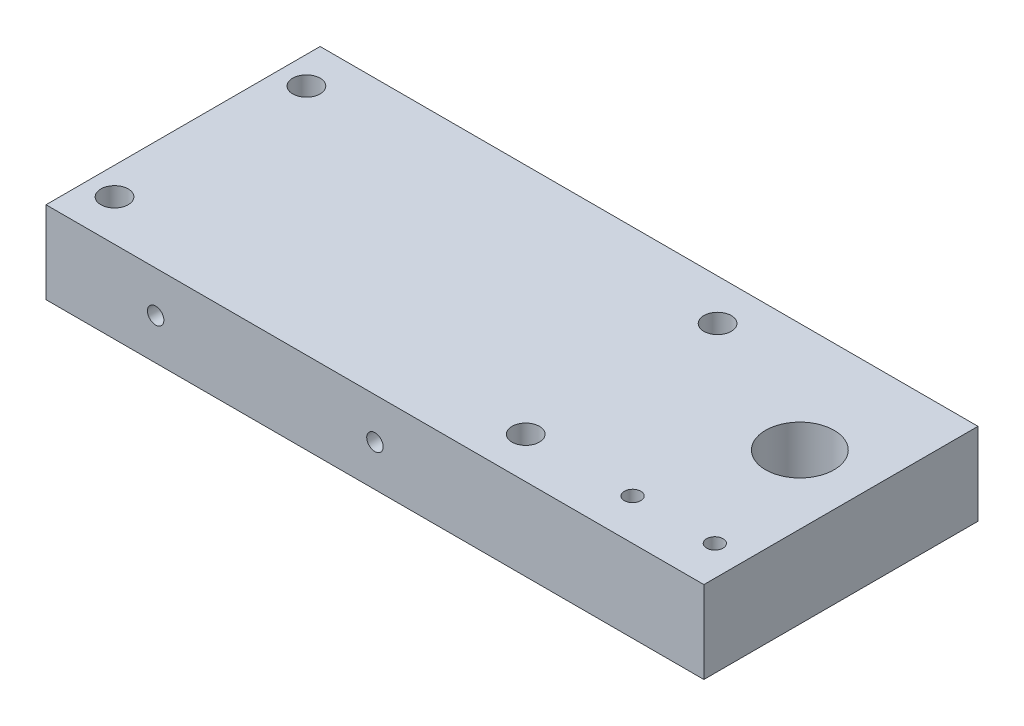
ISO-10303-21;
HEADER;
FILE_DESCRIPTION(('STEP AP214'),'2;1');
FILE_NAME('part.step','',(''),(''),'','','');
FILE_SCHEMA(('AUTOMOTIVE_DESIGN { 1 0 10303 214 1 1 1 1 }'));
ENDSEC;
DATA;
#1=APPLICATION_CONTEXT('core data for automotive mechanical design processes');
#2=APPLICATION_PROTOCOL_DEFINITION('international standard','automotive_design',2000,#1);
#3=PRODUCT_CONTEXT('',#1,'mechanical');
#4=PRODUCT('Part','Part','',(#3));
#5=PRODUCT_RELATED_PRODUCT_CATEGORY('part','',(#4));
#6=PRODUCT_DEFINITION_FORMATION('','',#4);
#7=PRODUCT_DEFINITION_CONTEXT('part definition',#1,'design');
#8=PRODUCT_DEFINITION('design','',#6,#7);
#9=PRODUCT_DEFINITION_SHAPE('','',#8);
#10=(LENGTH_UNIT() NAMED_UNIT(*) SI_UNIT(.MILLI.,.METRE.));
#11=(NAMED_UNIT(*) PLANE_ANGLE_UNIT() SI_UNIT($,.RADIAN.));
#12=(NAMED_UNIT(*) SI_UNIT($,.STERADIAN.) SOLID_ANGLE_UNIT());
#13=UNCERTAINTY_MEASURE_WITH_UNIT(LENGTH_MEASURE(1.E-05),#10,'distance_accuracy_value','');
#14=(GEOMETRIC_REPRESENTATION_CONTEXT(3) GLOBAL_UNCERTAINTY_ASSIGNED_CONTEXT((#13)) GLOBAL_UNIT_ASSIGNED_CONTEXT((#10,
#11,#12)) REPRESENTATION_CONTEXT('',''));
#15=CARTESIAN_POINT('',(0.,0.,0.));
#16=DIRECTION('',(0.,0.,1.));
#17=DIRECTION('',(1.,0.,0.));
#18=AXIS2_PLACEMENT_3D('',#15,#16,#17);
#19=CARTESIAN_POINT('',(120.,30.,50.));
#20=DIRECTION('',(-1.,0.,0.));
#21=DIRECTION('',(0.,0.,1.));
#22=AXIS2_PLACEMENT_3D('',#19,#20,#21);
#23=PLANE('',#22);
#24=DIRECTION('',(0.,0.,-1.));
#25=VECTOR('',#24,1.);
#26=CARTESIAN_POINT('',(120.,0.,50.));
#27=LINE('',#26,#25);
#28=CARTESIAN_POINT('',(120.,0.,50.));
#29=VERTEX_POINT('',#28);
#30=CARTESIAN_POINT('',(120.,0.,-50.));
#31=VERTEX_POINT('',#30);
#32=EDGE_CURVE('E190',#29,#31,#27,.T.);
#33=ORIENTED_EDGE('',*,*,#32,.T.);
#34=DIRECTION('',(0.,-1.,0.));
#35=VECTOR('',#34,1.);
#36=CARTESIAN_POINT('',(120.,30.,-50.));
#37=LINE('',#36,#35);
#38=CARTESIAN_POINT('',(120.,30.,-50.));
#39=VERTEX_POINT('',#38);
#40=EDGE_CURVE('E11',#39,#31,#37,.T.);
#41=ORIENTED_EDGE('',*,*,#40,.F.);
#42=DIRECTION('',(0.,0.,-1.));
#43=VECTOR('',#42,1.);
#44=CARTESIAN_POINT('',(120.,30.,50.));
#45=LINE('',#44,#43);
#46=CARTESIAN_POINT('',(120.,30.,50.));
#47=VERTEX_POINT('',#46);
#48=EDGE_CURVE('E191',#47,#39,#45,.T.);
#49=ORIENTED_EDGE('',*,*,#48,.F.);
#50=DIRECTION('',(0.,-1.,0.));
#51=VECTOR('',#50,1.);
#52=CARTESIAN_POINT('',(120.,30.,50.));
#53=LINE('',#52,#51);
#54=EDGE_CURVE('E197',#47,#29,#53,.T.);
#55=ORIENTED_EDGE('',*,*,#54,.T.);
#56=EDGE_LOOP('',(#33,#41,#49,#55));
#57=FACE_BOUND('',#56,.T.);
#58=ADVANCED_FACE('F17',(#57),#23,.F.);
#59=CARTESIAN_POINT('',(-120.,30.,-50.));
#60=DIRECTION('',(0.,0.,1.));
#61=DIRECTION('',(1.,0.,0.));
#62=AXIS2_PLACEMENT_3D('',#59,#60,#61);
#63=PLANE('',#62);
#64=CARTESIAN_POINT('',(0.,15.,-50.));
#65=DIRECTION('',(0.,0.,-1.));
#66=DIRECTION('',(-1.,0.,0.));
#67=AXIS2_PLACEMENT_3D('',#64,#65,#66);
#68=CIRCLE('',#67,3.);
#69=CARTESIAN_POINT('',(-3.00000000000001,15.,-50.));
#70=VERTEX_POINT('',#69);
#71=EDGE_CURVE('E112',#70,#70,#68,.T.);
#72=ORIENTED_EDGE('',*,*,#71,.F.);
#73=EDGE_LOOP('',(#72));
#74=FACE_BOUND('',#73,.T.);
#75=CARTESIAN_POINT('',(-80.,15.,-50.));
#76=DIRECTION('',(0.,0.,-1.));
#77=DIRECTION('',(-1.,0.,0.));
#78=AXIS2_PLACEMENT_3D('',#75,#76,#77);
#79=CIRCLE('',#78,3.);
#80=CARTESIAN_POINT('',(-83.,15.,-50.));
#81=VERTEX_POINT('',#80);
#82=EDGE_CURVE('E124',#81,#81,#79,.T.);
#83=ORIENTED_EDGE('',*,*,#82,.F.);
#84=EDGE_LOOP('',(#83));
#85=FACE_BOUND('',#84,.T.);
#86=DIRECTION('',(-1.,0.,0.));
#87=VECTOR('',#86,1.);
#88=CARTESIAN_POINT('',(-120.,0.,-50.));
#89=LINE('',#88,#87);
#90=CARTESIAN_POINT('',(-120.,0.,-50.));
#91=VERTEX_POINT('',#90);
#92=EDGE_CURVE('E200',#31,#91,#89,.T.);
#93=ORIENTED_EDGE('',*,*,#92,.T.);
#94=DIRECTION('',(0.,-1.,0.));
#95=VECTOR('',#94,1.);
#96=CARTESIAN_POINT('',(-120.,30.,-50.));
#97=LINE('',#96,#95);
#98=CARTESIAN_POINT('',(-120.,30.,-50.));
#99=VERTEX_POINT('',#98);
#100=EDGE_CURVE('E25',#99,#91,#97,.T.);
#101=ORIENTED_EDGE('',*,*,#100,.F.);
#102=DIRECTION('',(-1.,0.,0.));
#103=VECTOR('',#102,1.);
#104=CARTESIAN_POINT('',(-120.,30.,-50.));
#105=LINE('',#104,#103);
#106=EDGE_CURVE('E64',#39,#99,#105,.T.);
#107=ORIENTED_EDGE('',*,*,#106,.F.);
#108=ORIENTED_EDGE('',*,*,#40,.T.);
#109=EDGE_LOOP('',(#93,#101,#107,#108));
#110=FACE_BOUND('',#109,.T.);
#111=ADVANCED_FACE('F227',(#74,#85,#110),#63,.F.);
#112=CARTESIAN_POINT('',(-120.,30.,50.));
#113=DIRECTION('',(1.,0.,0.));
#114=DIRECTION('',(0.,0.,-1.));
#115=AXIS2_PLACEMENT_3D('',#112,#113,#114);
#116=PLANE('',#115);
#117=DIRECTION('',(0.,0.,1.));
#118=VECTOR('',#117,1.);
#119=CARTESIAN_POINT('',(-120.,0.,50.));
#120=LINE('',#119,#118);
#121=CARTESIAN_POINT('',(-120.,0.,50.));
#122=VERTEX_POINT('',#121);
#123=EDGE_CURVE('E51',#91,#122,#120,.T.);
#124=ORIENTED_EDGE('',*,*,#123,.T.);
#125=DIRECTION('',(0.,-1.,0.));
#126=VECTOR('',#125,1.);
#127=CARTESIAN_POINT('',(-120.,30.,50.));
#128=LINE('',#127,#126);
#129=CARTESIAN_POINT('',(-120.,30.,50.));
#130=VERTEX_POINT('',#129);
#131=EDGE_CURVE('E205',#130,#122,#128,.T.);
#132=ORIENTED_EDGE('',*,*,#131,.F.);
#133=DIRECTION('',(0.,0.,1.));
#134=VECTOR('',#133,1.);
#135=CARTESIAN_POINT('',(-120.,30.,50.));
#136=LINE('',#135,#134);
#137=EDGE_CURVE('E194',#99,#130,#136,.T.);
#138=ORIENTED_EDGE('',*,*,#137,.F.);
#139=ORIENTED_EDGE('',*,*,#100,.T.);
#140=EDGE_LOOP('',(#124,#132,#138,#139));
#141=FACE_BOUND('',#140,.T.);
#142=ADVANCED_FACE('F207',(#141),#116,.F.);
#143=CARTESIAN_POINT('',(-120.,30.,50.));
#144=DIRECTION('',(0.,0.,-1.));
#145=DIRECTION('',(-1.,0.,0.));
#146=AXIS2_PLACEMENT_3D('',#143,#144,#145);
#147=PLANE('',#146);
#148=CARTESIAN_POINT('',(0.,15.,50.));
#149=DIRECTION('',(0.,0.,1.));
#150=DIRECTION('',(1.,0.,0.));
#151=AXIS2_PLACEMENT_3D('',#148,#149,#150);
#152=CIRCLE('',#151,3.);
#153=CARTESIAN_POINT('',(2.99999999999999,15.,50.));
#154=VERTEX_POINT('',#153);
#155=EDGE_CURVE('E561',#154,#154,#152,.T.);
#156=ORIENTED_EDGE('',*,*,#155,.F.);
#157=EDGE_LOOP('',(#156));
#158=FACE_BOUND('',#157,.T.);
#159=CARTESIAN_POINT('',(-80.,15.,50.));
#160=DIRECTION('',(0.,0.,1.));
#161=DIRECTION('',(1.,0.,0.));
#162=AXIS2_PLACEMENT_3D('',#159,#160,#161);
#163=CIRCLE('',#162,3.);
#164=CARTESIAN_POINT('',(-77.,15.,50.));
#165=VERTEX_POINT('',#164);
#166=EDGE_CURVE('E93',#165,#165,#163,.T.);
#167=ORIENTED_EDGE('',*,*,#166,.F.);
#168=EDGE_LOOP('',(#167));
#169=FACE_BOUND('',#168,.T.);
#170=DIRECTION('',(1.,0.,0.));
#171=VECTOR('',#170,1.);
#172=CARTESIAN_POINT('',(-120.,0.,50.));
#173=LINE('',#172,#171);
#174=EDGE_CURVE('E57',#122,#29,#173,.T.);
#175=ORIENTED_EDGE('',*,*,#174,.T.);
#176=ORIENTED_EDGE('',*,*,#54,.F.);
#177=DIRECTION('',(1.,0.,0.));
#178=VECTOR('',#177,1.);
#179=CARTESIAN_POINT('',(-120.,30.,50.));
#180=LINE('',#179,#178);
#181=EDGE_CURVE('E33',#130,#47,#180,.T.);
#182=ORIENTED_EDGE('',*,*,#181,.F.);
#183=ORIENTED_EDGE('',*,*,#131,.T.);
#184=EDGE_LOOP('',(#175,#176,#182,#183));
#185=FACE_BOUND('',#184,.T.);
#186=ADVANCED_FACE('F214',(#158,#169,#185),#147,.F.);
#187=CARTESIAN_POINT('',(0.,30.,0.));
#188=DIRECTION('',(0.,-1.,0.));
#189=DIRECTION('',(0.,0.,-1.));
#190=AXIS2_PLACEMENT_3D('',#187,#188,#189);
#191=PLANE('',#190);
#192=CARTESIAN_POINT('',(79.,30.,35.));
#193=DIRECTION('',(0.,1.,0.));
#194=DIRECTION('',(0.,0.,1.));
#195=AXIS2_PLACEMENT_3D('',#192,#193,#194);
#196=CIRCLE('',#195,3.);
#197=CARTESIAN_POINT('',(79.,30.,38.));
#198=VERTEX_POINT('',#197);
#199=EDGE_CURVE('E136',#198,#198,#196,.T.);
#200=ORIENTED_EDGE('',*,*,#199,.F.);
#201=EDGE_LOOP('',(#200));
#202=FACE_BOUND('',#201,.T.);
#203=CARTESIAN_POINT('',(109.,30.,35.));
#204=DIRECTION('',(0.,1.,0.));
#205=DIRECTION('',(0.,0.,1.));
#206=AXIS2_PLACEMENT_3D('',#203,#204,#205);
#207=CIRCLE('',#206,3.);
#208=CARTESIAN_POINT('',(109.,30.,38.));
#209=VERTEX_POINT('',#208);
#210=EDGE_CURVE('E148',#209,#209,#207,.T.);
#211=ORIENTED_EDGE('',*,*,#210,.F.);
#212=EDGE_LOOP('',(#211));
#213=FACE_BOUND('',#212,.T.);
#214=CARTESIAN_POINT('',(95.,30.,-10.));
#215=DIRECTION('',(0.,1.,0.));
#216=DIRECTION('',(0.,0.,1.));
#217=AXIS2_PLACEMENT_3D('',#214,#215,#216);
#218=CIRCLE('',#217,12.5);
#219=CARTESIAN_POINT('',(95.,30.,2.5));
#220=VERTEX_POINT('',#219);
#221=EDGE_CURVE('E160',#220,#220,#218,.T.);
#222=ORIENTED_EDGE('',*,*,#221,.F.);
#223=EDGE_LOOP('',(#222));
#224=FACE_BOUND('',#223,.T.);
#225=CARTESIAN_POINT('',(40.,30.,35.));
#226=DIRECTION('',(0.,1.,0.));
#227=DIRECTION('',(0.,0.,1.));
#228=AXIS2_PLACEMENT_3D('',#225,#226,#227);
#229=CIRCLE('',#228,5.);
#230=CARTESIAN_POINT('',(40.,30.,40.));
#231=VERTEX_POINT('',#230);
#232=EDGE_CURVE('E166',#231,#231,#229,.T.);
#233=ORIENTED_EDGE('',*,*,#232,.F.);
#234=EDGE_LOOP('',(#233));
#235=FACE_BOUND('',#234,.T.);
#236=CARTESIAN_POINT('',(-110.,30.,35.));
#237=DIRECTION('',(0.,1.,0.));
#238=DIRECTION('',(0.,0.,1.));
#239=AXIS2_PLACEMENT_3D('',#236,#237,#238);
#240=CIRCLE('',#239,5.);
#241=CARTESIAN_POINT('',(-110.,30.,40.));
#242=VERTEX_POINT('',#241);
#243=EDGE_CURVE('E172',#242,#242,#240,.T.);
#244=ORIENTED_EDGE('',*,*,#243,.F.);
#245=EDGE_LOOP('',(#244));
#246=FACE_BOUND('',#245,.T.);
#247=CARTESIAN_POINT('',(-110.,30.,-35.));
#248=DIRECTION('',(0.,1.,0.));
#249=DIRECTION('',(0.,0.,1.));
#250=AXIS2_PLACEMENT_3D('',#247,#248,#249);
#251=CIRCLE('',#250,5.);
#252=CARTESIAN_POINT('',(-110.,30.,-30.));
#253=VERTEX_POINT('',#252);
#254=EDGE_CURVE('E178',#253,#253,#251,.T.);
#255=ORIENTED_EDGE('',*,*,#254,.F.);
#256=EDGE_LOOP('',(#255));
#257=FACE_BOUND('',#256,.T.);
#258=CARTESIAN_POINT('',(40.,30.,-35.));
#259=DIRECTION('',(0.,1.,0.));
#260=DIRECTION('',(0.,0.,1.));
#261=AXIS2_PLACEMENT_3D('',#258,#259,#260);
#262=CIRCLE('',#261,5.);
#263=CARTESIAN_POINT('',(40.,30.,-30.));
#264=VERTEX_POINT('',#263);
#265=EDGE_CURVE('E184',#264,#264,#262,.T.);
#266=ORIENTED_EDGE('',*,*,#265,.F.);
#267=EDGE_LOOP('',(#266));
#268=FACE_BOUND('',#267,.T.);
#269=ORIENTED_EDGE('',*,*,#48,.T.);
#270=ORIENTED_EDGE('',*,*,#106,.T.);
#271=ORIENTED_EDGE('',*,*,#137,.T.);
#272=ORIENTED_EDGE('',*,*,#181,.T.);
#273=EDGE_LOOP('',(#269,#270,#271,#272));
#274=FACE_BOUND('',#273,.T.);
#275=ADVANCED_FACE('F216',(#202,#213,#224,#235,#246,#257,#268,#274),#191,.F.);
#276=CARTESIAN_POINT('',(0.,0.,0.));
#277=DIRECTION('',(0.,-1.,0.));
#278=DIRECTION('',(0.,0.,-1.));
#279=AXIS2_PLACEMENT_3D('',#276,#277,#278);
#280=PLANE('',#279);
#281=CARTESIAN_POINT('',(95.,0.,-10.));
#282=DIRECTION('',(0.,1.,0.));
#283=DIRECTION('',(0.,0.,1.));
#284=AXIS2_PLACEMENT_3D('',#281,#282,#283);
#285=CIRCLE('',#284,12.5);
#286=CARTESIAN_POINT('',(95.,0.,2.5));
#287=VERTEX_POINT('',#286);
#288=EDGE_CURVE('E163',#287,#287,#285,.T.);
#289=ORIENTED_EDGE('',*,*,#288,.T.);
#290=EDGE_LOOP('',(#289));
#291=FACE_BOUND('',#290,.T.);
#292=CARTESIAN_POINT('',(40.,0.,35.));
#293=DIRECTION('',(0.,1.,0.));
#294=DIRECTION('',(0.,0.,1.));
#295=AXIS2_PLACEMENT_3D('',#292,#293,#294);
#296=CIRCLE('',#295,5.);
#297=CARTESIAN_POINT('',(40.,0.,40.));
#298=VERTEX_POINT('',#297);
#299=EDGE_CURVE('E169',#298,#298,#296,.T.);
#300=ORIENTED_EDGE('',*,*,#299,.T.);
#301=EDGE_LOOP('',(#300));
#302=FACE_BOUND('',#301,.T.);
#303=CARTESIAN_POINT('',(-110.,0.,35.));
#304=DIRECTION('',(0.,1.,0.));
#305=DIRECTION('',(0.,0.,1.));
#306=AXIS2_PLACEMENT_3D('',#303,#304,#305);
#307=CIRCLE('',#306,5.);
#308=CARTESIAN_POINT('',(-110.,0.,40.));
#309=VERTEX_POINT('',#308);
#310=EDGE_CURVE('E175',#309,#309,#307,.T.);
#311=ORIENTED_EDGE('',*,*,#310,.T.);
#312=EDGE_LOOP('',(#311));
#313=FACE_BOUND('',#312,.T.);
#314=CARTESIAN_POINT('',(-110.,0.,-35.));
#315=DIRECTION('',(0.,1.,0.));
#316=DIRECTION('',(0.,0.,1.));
#317=AXIS2_PLACEMENT_3D('',#314,#315,#316);
#318=CIRCLE('',#317,5.);
#319=CARTESIAN_POINT('',(-110.,0.,-30.));
#320=VERTEX_POINT('',#319);
#321=EDGE_CURVE('E181',#320,#320,#318,.T.);
#322=ORIENTED_EDGE('',*,*,#321,.T.);
#323=EDGE_LOOP('',(#322));
#324=FACE_BOUND('',#323,.T.);
#325=CARTESIAN_POINT('',(40.,0.,-35.));
#326=DIRECTION('',(0.,1.,0.));
#327=DIRECTION('',(0.,0.,1.));
#328=AXIS2_PLACEMENT_3D('',#325,#326,#327);
#329=CIRCLE('',#328,5.);
#330=CARTESIAN_POINT('',(40.,0.,-30.));
#331=VERTEX_POINT('',#330);
#332=EDGE_CURVE('E187',#331,#331,#329,.T.);
#333=ORIENTED_EDGE('',*,*,#332,.T.);
#334=EDGE_LOOP('',(#333));
#335=FACE_BOUND('',#334,.T.);
#336=ORIENTED_EDGE('',*,*,#32,.F.);
#337=ORIENTED_EDGE('',*,*,#174,.F.);
#338=ORIENTED_EDGE('',*,*,#123,.F.);
#339=ORIENTED_EDGE('',*,*,#92,.F.);
#340=EDGE_LOOP('',(#336,#337,#338,#339));
#341=FACE_BOUND('',#340,.T.);
#342=ADVANCED_FACE('F210',(#291,#302,#313,#324,#335,#341),#280,.T.);
#343=CARTESIAN_POINT('',(40.,30.,-35.));
#344=DIRECTION('',(0.,1.,0.));
#345=DIRECTION('',(0.,0.,1.));
#346=AXIS2_PLACEMENT_3D('',#343,#344,#345);
#347=CYLINDRICAL_SURFACE('',#346,5.);
#348=ORIENTED_EDGE('',*,*,#332,.F.);
#349=EDGE_LOOP('',(#348));
#350=FACE_BOUND('',#349,.T.);
#351=ORIENTED_EDGE('',*,*,#265,.T.);
#352=EDGE_LOOP('',(#351));
#353=FACE_BOUND('',#352,.T.);
#354=ADVANCED_FACE('F319',(#350,#353),#347,.F.);
#355=CARTESIAN_POINT('',(-110.,30.,-35.));
#356=DIRECTION('',(0.,1.,0.));
#357=DIRECTION('',(0.,0.,1.));
#358=AXIS2_PLACEMENT_3D('',#355,#356,#357);
#359=CYLINDRICAL_SURFACE('',#358,5.);
#360=ORIENTED_EDGE('',*,*,#321,.F.);
#361=EDGE_LOOP('',(#360));
#362=FACE_BOUND('',#361,.T.);
#363=ORIENTED_EDGE('',*,*,#254,.T.);
#364=EDGE_LOOP('',(#363));
#365=FACE_BOUND('',#364,.T.);
#366=ADVANCED_FACE('F315',(#362,#365),#359,.F.);
#367=CARTESIAN_POINT('',(-110.,30.,35.));
#368=DIRECTION('',(0.,1.,0.));
#369=DIRECTION('',(0.,0.,1.));
#370=AXIS2_PLACEMENT_3D('',#367,#368,#369);
#371=CYLINDRICAL_SURFACE('',#370,5.);
#372=ORIENTED_EDGE('',*,*,#310,.F.);
#373=EDGE_LOOP('',(#372));
#374=FACE_BOUND('',#373,.T.);
#375=ORIENTED_EDGE('',*,*,#243,.T.);
#376=EDGE_LOOP('',(#375));
#377=FACE_BOUND('',#376,.T.);
#378=ADVANCED_FACE('F311',(#374,#377),#371,.F.);
#379=CARTESIAN_POINT('',(40.,30.,35.));
#380=DIRECTION('',(0.,1.,0.));
#381=DIRECTION('',(0.,0.,1.));
#382=AXIS2_PLACEMENT_3D('',#379,#380,#381);
#383=CYLINDRICAL_SURFACE('',#382,5.);
#384=ORIENTED_EDGE('',*,*,#299,.F.);
#385=EDGE_LOOP('',(#384));
#386=FACE_BOUND('',#385,.T.);
#387=ORIENTED_EDGE('',*,*,#232,.T.);
#388=EDGE_LOOP('',(#387));
#389=FACE_BOUND('',#388,.T.);
#390=ADVANCED_FACE('F307',(#386,#389),#383,.F.);
#391=CARTESIAN_POINT('',(95.,30.,-10.));
#392=DIRECTION('',(0.,1.,0.));
#393=DIRECTION('',(0.,0.,1.));
#394=AXIS2_PLACEMENT_3D('',#391,#392,#393);
#395=CYLINDRICAL_SURFACE('',#394,12.5);
#396=ORIENTED_EDGE('',*,*,#288,.F.);
#397=EDGE_LOOP('',(#396));
#398=FACE_BOUND('',#397,.T.);
#399=ORIENTED_EDGE('',*,*,#221,.T.);
#400=EDGE_LOOP('',(#399));
#401=FACE_BOUND('',#400,.T.);
#402=ADVANCED_FACE('F303',(#398,#401),#395,.F.);
#403=CARTESIAN_POINT('',(109.,15.,35.));
#404=DIRECTION('',(0.,1.,0.));
#405=DIRECTION('',(0.,0.,1.));
#406=AXIS2_PLACEMENT_3D('',#403,#404,#405);
#407=CONICAL_SURFACE('',#406,2.5,1.02974425867665);
#408=CARTESIAN_POINT('',(109.,13.4978484524311,35.));
#409=VERTEX_POINT('',#408);
#410=VERTEX_LOOP('',#409);
#411=FACE_BOUND('',#410,.T.);
#412=CARTESIAN_POINT('',(109.,15.,35.));
#413=DIRECTION('',(0.,1.,0.));
#414=DIRECTION('',(0.,0.,1.));
#415=AXIS2_PLACEMENT_3D('',#412,#413,#414);
#416=CIRCLE('',#415,2.5);
#417=CARTESIAN_POINT('',(109.,15.,37.5));
#418=VERTEX_POINT('',#417);
#419=EDGE_CURVE('E157',#418,#418,#416,.T.);
#420=ORIENTED_EDGE('',*,*,#419,.T.);
#421=EDGE_LOOP('',(#420));
#422=FACE_BOUND('',#421,.T.);
#423=ADVANCED_FACE('F299',(#411,#422),#407,.F.);
#424=CARTESIAN_POINT('',(109.,30.,35.));
#425=DIRECTION('',(0.,1.,0.));
#426=DIRECTION('',(0.,0.,1.));
#427=AXIS2_PLACEMENT_3D('',#424,#425,#426);
#428=CYLINDRICAL_SURFACE('',#427,2.5);
#429=ORIENTED_EDGE('',*,*,#419,.F.);
#430=EDGE_LOOP('',(#429));
#431=FACE_BOUND('',#430,.T.);
#432=CARTESIAN_POINT('',(109.,18.,35.));
#433=DIRECTION('',(0.,1.,0.));
#434=DIRECTION('',(0.,0.,1.));
#435=AXIS2_PLACEMENT_3D('',#432,#433,#434);
#436=CIRCLE('',#435,2.5);
#437=CARTESIAN_POINT('',(109.,18.,37.5));
#438=VERTEX_POINT('',#437);
#439=EDGE_CURVE('E154',#438,#438,#436,.T.);
#440=ORIENTED_EDGE('',*,*,#439,.T.);
#441=EDGE_LOOP('',(#440));
#442=FACE_BOUND('',#441,.T.);
#443=ADVANCED_FACE('F295',(#431,#442),#428,.F.);
#444=CARTESIAN_POINT('',(111.5,18.,35.));
#445=DIRECTION('',(0.,-1.,0.));
#446=DIRECTION('',(0.,0.,-1.));
#447=AXIS2_PLACEMENT_3D('',#444,#445,#446);
#448=PLANE('',#447);
#449=ORIENTED_EDGE('',*,*,#439,.F.);
#450=EDGE_LOOP('',(#449));
#451=FACE_BOUND('',#450,.T.);
#452=CARTESIAN_POINT('',(109.,18.,35.));
#453=DIRECTION('',(0.,1.,0.));
#454=DIRECTION('',(0.,0.,1.));
#455=AXIS2_PLACEMENT_3D('',#452,#453,#454);
#456=CIRCLE('',#455,3.);
#457=CARTESIAN_POINT('',(109.,18.,38.));
#458=VERTEX_POINT('',#457);
#459=EDGE_CURVE('E151',#458,#458,#456,.T.);
#460=ORIENTED_EDGE('',*,*,#459,.T.);
#461=EDGE_LOOP('',(#460));
#462=FACE_BOUND('',#461,.T.);
#463=ADVANCED_FACE('F291',(#451,#462),#448,.F.);
#464=CARTESIAN_POINT('',(109.,30.,35.));
#465=DIRECTION('',(0.,1.,0.));
#466=DIRECTION('',(0.,0.,1.));
#467=AXIS2_PLACEMENT_3D('',#464,#465,#466);
#468=CYLINDRICAL_SURFACE('',#467,3.);
#469=ORIENTED_EDGE('',*,*,#459,.F.);
#470=EDGE_LOOP('',(#469));
#471=FACE_BOUND('',#470,.T.);
#472=ORIENTED_EDGE('',*,*,#210,.T.);
#473=EDGE_LOOP('',(#472));
#474=FACE_BOUND('',#473,.T.);
#475=ADVANCED_FACE('F287',(#471,#474),#468,.F.);
#476=CARTESIAN_POINT('',(79.,15.,35.));
#477=DIRECTION('',(0.,1.,0.));
#478=DIRECTION('',(0.,0.,1.));
#479=AXIS2_PLACEMENT_3D('',#476,#477,#478);
#480=CONICAL_SURFACE('',#479,2.5,1.02974425867665);
#481=CARTESIAN_POINT('',(79.,13.4978484524311,35.));
#482=VERTEX_POINT('',#481);
#483=VERTEX_LOOP('',#482);
#484=FACE_BOUND('',#483,.T.);
#485=CARTESIAN_POINT('',(79.,15.,35.));
#486=DIRECTION('',(0.,1.,0.));
#487=DIRECTION('',(0.,0.,1.));
#488=AXIS2_PLACEMENT_3D('',#485,#486,#487);
#489=CIRCLE('',#488,2.5);
#490=CARTESIAN_POINT('',(79.,15.,37.5));
#491=VERTEX_POINT('',#490);
#492=EDGE_CURVE('E145',#491,#491,#489,.T.);
#493=ORIENTED_EDGE('',*,*,#492,.T.);
#494=EDGE_LOOP('',(#493));
#495=FACE_BOUND('',#494,.T.);
#496=ADVANCED_FACE('F283',(#484,#495),#480,.F.);
#497=CARTESIAN_POINT('',(79.,30.,35.));
#498=DIRECTION('',(0.,1.,0.));
#499=DIRECTION('',(0.,0.,1.));
#500=AXIS2_PLACEMENT_3D('',#497,#498,#499);
#501=CYLINDRICAL_SURFACE('',#500,2.5);
#502=ORIENTED_EDGE('',*,*,#492,.F.);
#503=EDGE_LOOP('',(#502));
#504=FACE_BOUND('',#503,.T.);
#505=CARTESIAN_POINT('',(79.,18.,35.));
#506=DIRECTION('',(0.,1.,0.));
#507=DIRECTION('',(0.,0.,1.));
#508=AXIS2_PLACEMENT_3D('',#505,#506,#507);
#509=CIRCLE('',#508,2.5);
#510=CARTESIAN_POINT('',(79.,18.,37.5));
#511=VERTEX_POINT('',#510);
#512=EDGE_CURVE('E142',#511,#511,#509,.T.);
#513=ORIENTED_EDGE('',*,*,#512,.T.);
#514=EDGE_LOOP('',(#513));
#515=FACE_BOUND('',#514,.T.);
#516=ADVANCED_FACE('F279',(#504,#515),#501,.F.);
#517=CARTESIAN_POINT('',(81.5,18.,35.));
#518=DIRECTION('',(0.,-1.,0.));
#519=DIRECTION('',(0.,0.,-1.));
#520=AXIS2_PLACEMENT_3D('',#517,#518,#519);
#521=PLANE('',#520);
#522=ORIENTED_EDGE('',*,*,#512,.F.);
#523=EDGE_LOOP('',(#522));
#524=FACE_BOUND('',#523,.T.);
#525=CARTESIAN_POINT('',(79.,18.,35.));
#526=DIRECTION('',(0.,1.,0.));
#527=DIRECTION('',(0.,0.,1.));
#528=AXIS2_PLACEMENT_3D('',#525,#526,#527);
#529=CIRCLE('',#528,3.);
#530=CARTESIAN_POINT('',(79.,18.,38.));
#531=VERTEX_POINT('',#530);
#532=EDGE_CURVE('E139',#531,#531,#529,.T.);
#533=ORIENTED_EDGE('',*,*,#532,.T.);
#534=EDGE_LOOP('',(#533));
#535=FACE_BOUND('',#534,.T.);
#536=ADVANCED_FACE('F275',(#524,#535),#521,.F.);
#537=CARTESIAN_POINT('',(79.,30.,35.));
#538=DIRECTION('',(0.,1.,0.));
#539=DIRECTION('',(0.,0.,1.));
#540=AXIS2_PLACEMENT_3D('',#537,#538,#539);
#541=CYLINDRICAL_SURFACE('',#540,3.);
#542=ORIENTED_EDGE('',*,*,#532,.F.);
#543=EDGE_LOOP('',(#542));
#544=FACE_BOUND('',#543,.T.);
#545=ORIENTED_EDGE('',*,*,#199,.T.);
#546=EDGE_LOOP('',(#545));
#547=FACE_BOUND('',#546,.T.);
#548=ADVANCED_FACE('F271',(#544,#547),#541,.F.);
#549=CARTESIAN_POINT('',(-80.,15.,-33.));
#550=DIRECTION('',(0.,0.,-1.));
#551=DIRECTION('',(-1.,0.,0.));
#552=AXIS2_PLACEMENT_3D('',#549,#550,#551);
#553=CONICAL_SURFACE('',#552,2.5,1.02974425867665);
#554=CARTESIAN_POINT('',(-80.,15.,-31.4978484524311));
#555=VERTEX_POINT('',#554);
#556=VERTEX_LOOP('',#555);
#557=FACE_BOUND('',#556,.T.);
#558=CARTESIAN_POINT('',(-80.,15.,-33.));
#559=DIRECTION('',(0.,0.,-1.));
#560=DIRECTION('',(-1.,0.,0.));
#561=AXIS2_PLACEMENT_3D('',#558,#559,#560);
#562=CIRCLE('',#561,2.5);
#563=CARTESIAN_POINT('',(-82.5,15.,-33.));
#564=VERTEX_POINT('',#563);
#565=EDGE_CURVE('E133',#564,#564,#562,.T.);
#566=ORIENTED_EDGE('',*,*,#565,.T.);
#567=EDGE_LOOP('',(#566));
#568=FACE_BOUND('',#567,.T.);
#569=ADVANCED_FACE('F267',(#557,#568),#553,.F.);
#570=CARTESIAN_POINT('',(-80.,15.,-50.));
#571=DIRECTION('',(0.,0.,-1.));
#572=DIRECTION('',(-1.,0.,0.));
#573=AXIS2_PLACEMENT_3D('',#570,#571,#572);
#574=CYLINDRICAL_SURFACE('',#573,2.5);
#575=ORIENTED_EDGE('',*,*,#565,.F.);
#576=EDGE_LOOP('',(#575));
#577=FACE_BOUND('',#576,.T.);
#578=CARTESIAN_POINT('',(-80.,15.,-38.));
#579=DIRECTION('',(0.,0.,-1.));
#580=DIRECTION('',(-1.,0.,0.));
#581=AXIS2_PLACEMENT_3D('',#578,#579,#580);
#582=CIRCLE('',#581,2.5);
#583=CARTESIAN_POINT('',(-82.5,15.,-38.));
#584=VERTEX_POINT('',#583);
#585=EDGE_CURVE('E130',#584,#584,#582,.T.);
#586=ORIENTED_EDGE('',*,*,#585,.T.);
#587=EDGE_LOOP('',(#586));
#588=FACE_BOUND('',#587,.T.);
#589=ADVANCED_FACE('F259',(#577,#588),#574,.F.);
#590=CARTESIAN_POINT('',(-77.5,15.,-38.));
#591=DIRECTION('',(0.,0.,1.));
#592=DIRECTION('',(1.,0.,0.));
#593=AXIS2_PLACEMENT_3D('',#590,#591,#592);
#594=PLANE('',#593);
#595=ORIENTED_EDGE('',*,*,#585,.F.);
#596=EDGE_LOOP('',(#595));
#597=FACE_BOUND('',#596,.T.);
#598=CARTESIAN_POINT('',(-80.,15.,-38.));
#599=DIRECTION('',(0.,0.,-1.));
#600=DIRECTION('',(-1.,0.,0.));
#601=AXIS2_PLACEMENT_3D('',#598,#599,#600);
#602=CIRCLE('',#601,3.);
#603=CARTESIAN_POINT('',(-83.,15.,-38.));
#604=VERTEX_POINT('',#603);
#605=EDGE_CURVE('E127',#604,#604,#602,.T.);
#606=ORIENTED_EDGE('',*,*,#605,.T.);
#607=EDGE_LOOP('',(#606));
#608=FACE_BOUND('',#607,.T.);
#609=ADVANCED_FACE('F248',(#597,#608),#594,.F.);
#610=CARTESIAN_POINT('',(-80.,15.,-50.));
#611=DIRECTION('',(0.,0.,-1.));
#612=DIRECTION('',(-1.,0.,0.));
#613=AXIS2_PLACEMENT_3D('',#610,#611,#612);
#614=CYLINDRICAL_SURFACE('',#613,3.);
#615=ORIENTED_EDGE('',*,*,#605,.F.);
#616=EDGE_LOOP('',(#615));
#617=FACE_BOUND('',#616,.T.);
#618=ORIENTED_EDGE('',*,*,#82,.T.);
#619=EDGE_LOOP('',(#618));
#620=FACE_BOUND('',#619,.T.);
#621=ADVANCED_FACE('F245',(#617,#620),#614,.F.);
#622=CARTESIAN_POINT('',(0.,15.,-33.));
#623=DIRECTION('',(0.,0.,-1.));
#624=DIRECTION('',(-1.,0.,0.));
#625=AXIS2_PLACEMENT_3D('',#622,#623,#624);
#626=CONICAL_SURFACE('',#625,2.5,1.02974425867665);
#627=CARTESIAN_POINT('',(0.,15.,-31.4978484524311));
#628=VERTEX_POINT('',#627);
#629=VERTEX_LOOP('',#628);
#630=FACE_BOUND('',#629,.T.);
#631=CARTESIAN_POINT('',(0.,15.,-33.));
#632=DIRECTION('',(0.,0.,-1.));
#633=DIRECTION('',(-1.,0.,0.));
#634=AXIS2_PLACEMENT_3D('',#631,#632,#633);
#635=CIRCLE('',#634,2.5);
#636=CARTESIAN_POINT('',(-2.50000000000001,15.,-33.));
#637=VERTEX_POINT('',#636);
#638=EDGE_CURVE('E121',#637,#637,#635,.T.);
#639=ORIENTED_EDGE('',*,*,#638,.T.);
#640=EDGE_LOOP('',(#639));
#641=FACE_BOUND('',#640,.T.);
#642=ADVANCED_FACE('F247',(#630,#641),#626,.F.);
#643=CARTESIAN_POINT('',(0.,15.,-50.));
#644=DIRECTION('',(0.,0.,-1.));
#645=DIRECTION('',(-1.,0.,0.));
#646=AXIS2_PLACEMENT_3D('',#643,#644,#645);
#647=CYLINDRICAL_SURFACE('',#646,2.5);
#648=ORIENTED_EDGE('',*,*,#638,.F.);
#649=EDGE_LOOP('',(#648));
#650=FACE_BOUND('',#649,.T.);
#651=CARTESIAN_POINT('',(0.,15.,-38.));
#652=DIRECTION('',(0.,0.,-1.));
#653=DIRECTION('',(-1.,0.,0.));
#654=AXIS2_PLACEMENT_3D('',#651,#652,#653);
#655=CIRCLE('',#654,2.5);
#656=CARTESIAN_POINT('',(-2.50000000000001,15.,-38.));
#657=VERTEX_POINT('',#656);
#658=EDGE_CURVE('E118',#657,#657,#655,.T.);
#659=ORIENTED_EDGE('',*,*,#658,.T.);
#660=EDGE_LOOP('',(#659));
#661=FACE_BOUND('',#660,.T.);
#662=ADVANCED_FACE('F256',(#650,#661),#647,.F.);
#663=CARTESIAN_POINT('',(2.5,15.,-38.));
#664=DIRECTION('',(0.,0.,1.));
#665=DIRECTION('',(1.,0.,0.));
#666=AXIS2_PLACEMENT_3D('',#663,#664,#665);
#667=PLANE('',#666);
#668=ORIENTED_EDGE('',*,*,#658,.F.);
#669=EDGE_LOOP('',(#668));
#670=FACE_BOUND('',#669,.T.);
#671=CARTESIAN_POINT('',(0.,15.,-38.));
#672=DIRECTION('',(0.,0.,-1.));
#673=DIRECTION('',(-1.,0.,0.));
#674=AXIS2_PLACEMENT_3D('',#671,#672,#673);
#675=CIRCLE('',#674,3.);
#676=CARTESIAN_POINT('',(-3.00000000000001,15.,-38.));
#677=VERTEX_POINT('',#676);
#678=EDGE_CURVE('E115',#677,#677,#675,.T.);
#679=ORIENTED_EDGE('',*,*,#678,.T.);
#680=EDGE_LOOP('',(#679));
#681=FACE_BOUND('',#680,.T.);
#682=ADVANCED_FACE('F458',(#670,#681),#667,.F.);
#683=CARTESIAN_POINT('',(0.,15.,-50.));
#684=DIRECTION('',(0.,0.,-1.));
#685=DIRECTION('',(-1.,0.,0.));
#686=AXIS2_PLACEMENT_3D('',#683,#684,#685);
#687=CYLINDRICAL_SURFACE('',#686,3.);
#688=ORIENTED_EDGE('',*,*,#678,.F.);
#689=EDGE_LOOP('',(#688));
#690=FACE_BOUND('',#689,.T.);
#691=ORIENTED_EDGE('',*,*,#71,.T.);
#692=EDGE_LOOP('',(#691));
#693=FACE_BOUND('',#692,.T.);
#694=ADVANCED_FACE('F467',(#690,#693),#687,.F.);
#695=CARTESIAN_POINT('',(-80.,15.,33.));
#696=DIRECTION('',(0.,0.,1.));
#697=DIRECTION('',(1.,0.,0.));
#698=AXIS2_PLACEMENT_3D('',#695,#696,#697);
#699=CONICAL_SURFACE('',#698,2.5,1.02974425867665);
#700=CARTESIAN_POINT('',(-80.,15.,31.4978484524311));
#701=VERTEX_POINT('',#700);
#702=VERTEX_LOOP('',#701);
#703=FACE_BOUND('',#702,.T.);
#704=CARTESIAN_POINT('',(-80.,15.,33.));
#705=DIRECTION('',(0.,0.,1.));
#706=DIRECTION('',(1.,0.,0.));
#707=AXIS2_PLACEMENT_3D('',#704,#705,#706);
#708=CIRCLE('',#707,2.5);
#709=CARTESIAN_POINT('',(-77.5,15.,33.));
#710=VERTEX_POINT('',#709);
#711=EDGE_CURVE('E109',#710,#710,#708,.T.);
#712=ORIENTED_EDGE('',*,*,#711,.T.);
#713=EDGE_LOOP('',(#712));
#714=FACE_BOUND('',#713,.T.);
#715=ADVANCED_FACE('F477',(#703,#714),#699,.F.);
#716=CARTESIAN_POINT('',(-80.,15.,50.));
#717=DIRECTION('',(0.,0.,1.));
#718=DIRECTION('',(1.,0.,0.));
#719=AXIS2_PLACEMENT_3D('',#716,#717,#718);
#720=CYLINDRICAL_SURFACE('',#719,2.5);
#721=ORIENTED_EDGE('',*,*,#711,.F.);
#722=EDGE_LOOP('',(#721));
#723=FACE_BOUND('',#722,.T.);
#724=CARTESIAN_POINT('',(-80.,15.,38.));
#725=DIRECTION('',(0.,0.,1.));
#726=DIRECTION('',(1.,0.,0.));
#727=AXIS2_PLACEMENT_3D('',#724,#725,#726);
#728=CIRCLE('',#727,2.5);
#729=CARTESIAN_POINT('',(-77.5,15.,38.));
#730=VERTEX_POINT('',#729);
#731=EDGE_CURVE('E106',#730,#730,#728,.T.);
#732=ORIENTED_EDGE('',*,*,#731,.T.);
#733=EDGE_LOOP('',(#732));
#734=FACE_BOUND('',#733,.T.);
#735=ADVANCED_FACE('F487',(#723,#734),#720,.F.);
#736=CARTESIAN_POINT('',(-77.5,15.,38.));
#737=DIRECTION('',(0.,0.,-1.));
#738=DIRECTION('',(-1.,0.,0.));
#739=AXIS2_PLACEMENT_3D('',#736,#737,#738);
#740=PLANE('',#739);
#741=ORIENTED_EDGE('',*,*,#731,.F.);
#742=EDGE_LOOP('',(#741));
#743=FACE_BOUND('',#742,.T.);
#744=CARTESIAN_POINT('',(-80.,15.,38.));
#745=DIRECTION('',(0.,0.,1.));
#746=DIRECTION('',(1.,0.,0.));
#747=AXIS2_PLACEMENT_3D('',#744,#745,#746);
#748=CIRCLE('',#747,3.);
#749=CARTESIAN_POINT('',(-77.,15.,38.));
#750=VERTEX_POINT('',#749);
#751=EDGE_CURVE('E97',#750,#750,#748,.T.);
#752=ORIENTED_EDGE('',*,*,#751,.T.);
#753=EDGE_LOOP('',(#752));
#754=FACE_BOUND('',#753,.T.);
#755=ADVANCED_FACE('F497',(#743,#754),#740,.F.);
#756=CARTESIAN_POINT('',(-80.,15.,50.));
#757=DIRECTION('',(0.,0.,1.));
#758=DIRECTION('',(1.,0.,0.));
#759=AXIS2_PLACEMENT_3D('',#756,#757,#758);
#760=CYLINDRICAL_SURFACE('',#759,3.);
#761=ORIENTED_EDGE('',*,*,#751,.F.);
#762=EDGE_LOOP('',(#761));
#763=FACE_BOUND('',#762,.T.);
#764=ORIENTED_EDGE('',*,*,#166,.T.);
#765=EDGE_LOOP('',(#764));
#766=FACE_BOUND('',#765,.T.);
#767=ADVANCED_FACE('F87',(#763,#766),#760,.F.);
#768=CARTESIAN_POINT('',(0.,15.,33.));
#769=DIRECTION('',(0.,0.,1.));
#770=DIRECTION('',(1.,0.,0.));
#771=AXIS2_PLACEMENT_3D('',#768,#769,#770);
#772=CONICAL_SURFACE('',#771,2.5,1.02974425867665);
#773=CARTESIAN_POINT('',(0.,15.,31.4978484524311));
#774=VERTEX_POINT('',#773);
#775=VERTEX_LOOP('',#774);
#776=FACE_BOUND('',#775,.T.);
#777=CARTESIAN_POINT('',(0.,15.,33.));
#778=DIRECTION('',(0.,0.,1.));
#779=DIRECTION('',(1.,0.,0.));
#780=AXIS2_PLACEMENT_3D('',#777,#778,#779);
#781=CIRCLE('',#780,2.5);
#782=CARTESIAN_POINT('',(2.49999999999999,15.,33.));
#783=VERTEX_POINT('',#782);
#784=EDGE_CURVE('E91',#783,#783,#781,.T.);
#785=ORIENTED_EDGE('',*,*,#784,.T.);
#786=EDGE_LOOP('',(#785));
#787=FACE_BOUND('',#786,.T.);
#788=ADVANCED_FACE('F83',(#776,#787),#772,.F.);
#789=CARTESIAN_POINT('',(0.,15.,50.));
#790=DIRECTION('',(0.,0.,1.));
#791=DIRECTION('',(1.,0.,0.));
#792=AXIS2_PLACEMENT_3D('',#789,#790,#791);
#793=CYLINDRICAL_SURFACE('',#792,2.5);
#794=ORIENTED_EDGE('',*,*,#784,.F.);
#795=EDGE_LOOP('',(#794));
#796=FACE_BOUND('',#795,.T.);
#797=CARTESIAN_POINT('',(0.,15.,38.));
#798=DIRECTION('',(0.,0.,1.));
#799=DIRECTION('',(1.,0.,0.));
#800=AXIS2_PLACEMENT_3D('',#797,#798,#799);
#801=CIRCLE('',#800,2.5);
#802=CARTESIAN_POINT('',(2.49999999999999,15.,38.));
#803=VERTEX_POINT('',#802);
#804=EDGE_CURVE('E94',#803,#803,#801,.T.);
#805=ORIENTED_EDGE('',*,*,#804,.T.);
#806=EDGE_LOOP('',(#805));
#807=FACE_BOUND('',#806,.T.);
#808=ADVANCED_FACE('F86',(#796,#807),#793,.F.);
#809=CARTESIAN_POINT('',(2.5,15.,38.));
#810=DIRECTION('',(0.,0.,-1.));
#811=DIRECTION('',(-1.,0.,0.));
#812=AXIS2_PLACEMENT_3D('',#809,#810,#811);
#813=PLANE('',#812);
#814=ORIENTED_EDGE('',*,*,#804,.F.);
#815=EDGE_LOOP('',(#814));
#816=FACE_BOUND('',#815,.T.);
#817=CARTESIAN_POINT('',(0.,15.,38.));
#818=DIRECTION('',(0.,0.,1.));
#819=DIRECTION('',(1.,0.,0.));
#820=AXIS2_PLACEMENT_3D('',#817,#818,#819);
#821=CIRCLE('',#820,3.);
#822=CARTESIAN_POINT('',(2.99999999999999,15.,38.));
#823=VERTEX_POINT('',#822);
#824=EDGE_CURVE('E100',#823,#823,#821,.T.);
#825=ORIENTED_EDGE('',*,*,#824,.T.);
#826=EDGE_LOOP('',(#825));
#827=FACE_BOUND('',#826,.T.);
#828=ADVANCED_FACE('F532',(#816,#827),#813,.F.);
#829=CARTESIAN_POINT('',(0.,15.,50.));
#830=DIRECTION('',(0.,0.,1.));
#831=DIRECTION('',(1.,0.,0.));
#832=AXIS2_PLACEMENT_3D('',#829,#830,#831);
#833=CYLINDRICAL_SURFACE('',#832,3.);
#834=ORIENTED_EDGE('',*,*,#824,.F.);
#835=EDGE_LOOP('',(#834));
#836=FACE_BOUND('',#835,.T.);
#837=ORIENTED_EDGE('',*,*,#155,.T.);
#838=EDGE_LOOP('',(#837));
#839=FACE_BOUND('',#838,.T.);
#840=ADVANCED_FACE('F541',(#836,#839),#833,.F.);
#841=CLOSED_SHELL('',(#58,#111,#142,#186,#275,#342,#354,#366,#378,#390,#402,#423,#443,#463,#475,
#496,#516,#536,#548,#569,#589,#609,#621,#642,#662,#682,#694,#715,#735,#755,#767,#788,#808,#828,#840));
#842=MANIFOLD_SOLID_BREP('B1',#841);
#843=ADVANCED_BREP_SHAPE_REPRESENTATION('',(#18,#842),#14);
#844=SHAPE_DEFINITION_REPRESENTATION(#9,#843);
ENDSEC;
END-ISO-10303-21;
